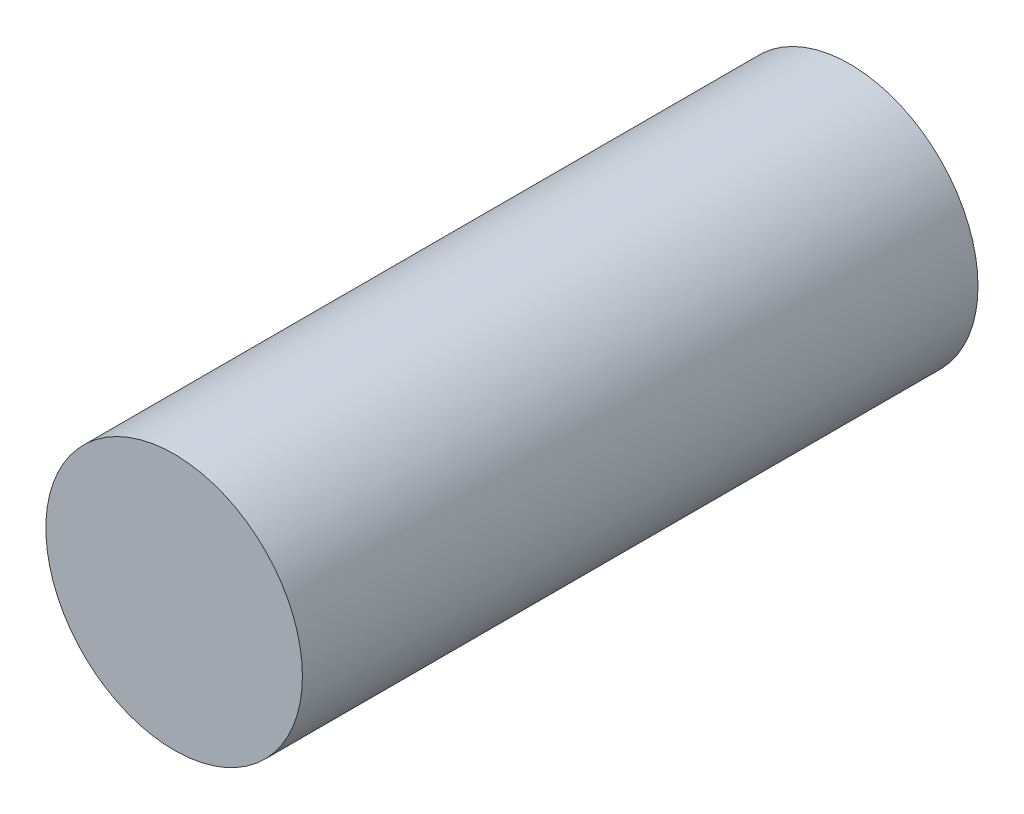
ISO-10303-21;
HEADER;
FILE_DESCRIPTION(('STEP AP214'),'2;1');
FILE_NAME('part.step','',(''),(''),'','','');
FILE_SCHEMA(('AUTOMOTIVE_DESIGN { 1 0 10303 214 1 1 1 1 }'));
ENDSEC;
DATA;
#1=APPLICATION_CONTEXT('core data for automotive mechanical design processes');
#2=APPLICATION_PROTOCOL_DEFINITION('international standard','automotive_design',2000,#1);
#3=PRODUCT_CONTEXT('',#1,'mechanical');
#4=PRODUCT('Part','Part','',(#3));
#5=PRODUCT_RELATED_PRODUCT_CATEGORY('part','',(#4));
#6=PRODUCT_DEFINITION_FORMATION('','',#4);
#7=PRODUCT_DEFINITION_CONTEXT('part definition',#1,'design');
#8=PRODUCT_DEFINITION('design','',#6,#7);
#9=PRODUCT_DEFINITION_SHAPE('','',#8);
#10=(LENGTH_UNIT() NAMED_UNIT(*) SI_UNIT(.MILLI.,.METRE.));
#11=(NAMED_UNIT(*) PLANE_ANGLE_UNIT() SI_UNIT($,.RADIAN.));
#12=(NAMED_UNIT(*) SI_UNIT($,.STERADIAN.) SOLID_ANGLE_UNIT());
#13=UNCERTAINTY_MEASURE_WITH_UNIT(LENGTH_MEASURE(1.E-05),#10,'distance_accuracy_value','');
#14=(GEOMETRIC_REPRESENTATION_CONTEXT(3) GLOBAL_UNCERTAINTY_ASSIGNED_CONTEXT((#13)) GLOBAL_UNIT_ASSIGNED_CONTEXT((#10,
#11,#12)) REPRESENTATION_CONTEXT('',''));
#15=CARTESIAN_POINT('',(0.,0.,0.));
#16=DIRECTION('',(0.,0.,1.));
#17=DIRECTION('',(1.,0.,0.));
#18=AXIS2_PLACEMENT_3D('',#15,#16,#17);
#19=CARTESIAN_POINT('',(0.,0.,7.9));
#20=DIRECTION('',(0.,0.,-1.));
#21=DIRECTION('',(-1.,0.,0.));
#22=AXIS2_PLACEMENT_3D('',#19,#20,#21);
#23=CYLINDRICAL_SURFACE('',#22,1.5);
#24=CARTESIAN_POINT('',(0.,0.,7.9));
#25=DIRECTION('',(0.,0.,1.));
#26=DIRECTION('',(1.,0.,0.));
#27=AXIS2_PLACEMENT_3D('',#24,#25,#26);
#28=CIRCLE('',#27,1.5);
#29=CARTESIAN_POINT('',(1.5,0.,7.9));
#30=VERTEX_POINT('',#29);
#31=EDGE_CURVE('E10',#30,#30,#28,.T.);
#32=ORIENTED_EDGE('',*,*,#31,.F.);
#33=EDGE_LOOP('',(#32));
#34=FACE_BOUND('',#33,.T.);
#35=CARTESIAN_POINT('',(0.,0.,0.));
#36=DIRECTION('',(0.,0.,1.));
#37=DIRECTION('',(1.,0.,0.));
#38=AXIS2_PLACEMENT_3D('',#35,#36,#37);
#39=CIRCLE('',#38,1.5);
#40=CARTESIAN_POINT('',(1.5,0.,0.));
#41=VERTEX_POINT('',#40);
#42=EDGE_CURVE('E33',#41,#41,#39,.T.);
#43=ORIENTED_EDGE('',*,*,#42,.T.);
#44=EDGE_LOOP('',(#43));
#45=FACE_BOUND('',#44,.T.);
#46=ADVANCED_FACE('F30',(#34,#45),#23,.T.);
#47=CARTESIAN_POINT('',(0.,0.,7.9));
#48=DIRECTION('',(0.,0.,1.));
#49=DIRECTION('',(1.,0.,0.));
#50=AXIS2_PLACEMENT_3D('',#47,#48,#49);
#51=PLANE('',#50);
#52=ORIENTED_EDGE('',*,*,#31,.T.);
#53=EDGE_LOOP('',(#52));
#54=FACE_BOUND('',#53,.T.);
#55=ADVANCED_FACE('F45',(#54),#51,.T.);
#56=CARTESIAN_POINT('',(0.,0.,0.));
#57=DIRECTION('',(0.,0.,1.));
#58=DIRECTION('',(1.,0.,0.));
#59=AXIS2_PLACEMENT_3D('',#56,#57,#58);
#60=PLANE('',#59);
#61=ORIENTED_EDGE('',*,*,#42,.F.);
#62=EDGE_LOOP('',(#61));
#63=FACE_BOUND('',#62,.T.);
#64=ADVANCED_FACE('F43',(#63),#60,.F.);
#65=CLOSED_SHELL('',(#46,#55,#64));
#66=MANIFOLD_SOLID_BREP('B2',#65);
#67=ADVANCED_BREP_SHAPE_REPRESENTATION('',(#18,#66),#14);
#68=SHAPE_DEFINITION_REPRESENTATION(#9,#67);
ENDSEC;
END-ISO-10303-21;
